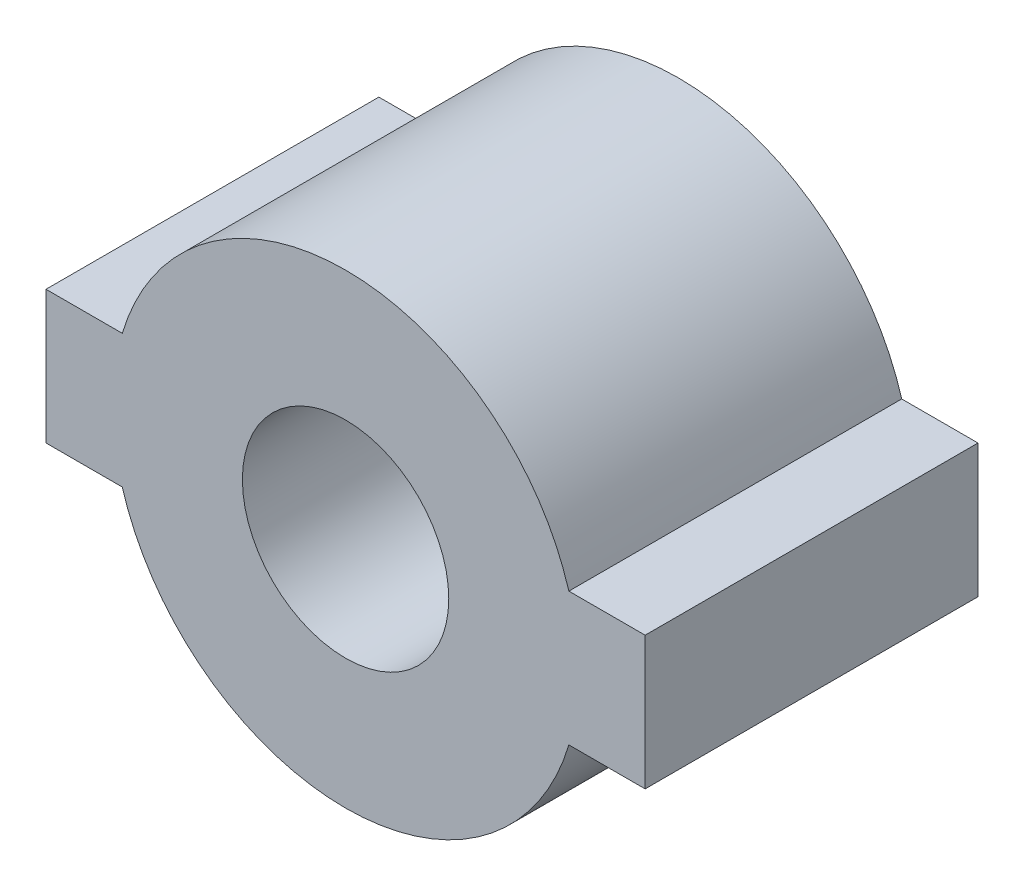
ISO-10303-21;
HEADER;
FILE_DESCRIPTION(('STEP AP214'),'2;1');
FILE_NAME('part.step','',(''),(''),'','','');
FILE_SCHEMA(('AUTOMOTIVE_DESIGN { 1 0 10303 214 1 1 1 1 }'));
ENDSEC;
DATA;
#1=APPLICATION_CONTEXT('core data for automotive mechanical design processes');
#2=APPLICATION_PROTOCOL_DEFINITION('international standard','automotive_design',2000,#1);
#3=PRODUCT_CONTEXT('',#1,'mechanical');
#4=PRODUCT('Part','Part','',(#3));
#5=PRODUCT_RELATED_PRODUCT_CATEGORY('part','',(#4));
#6=PRODUCT_DEFINITION_FORMATION('','',#4);
#7=PRODUCT_DEFINITION_CONTEXT('part definition',#1,'design');
#8=PRODUCT_DEFINITION('design','',#6,#7);
#9=PRODUCT_DEFINITION_SHAPE('','',#8);
#10=(LENGTH_UNIT() NAMED_UNIT(*) SI_UNIT(.MILLI.,.METRE.));
#11=(NAMED_UNIT(*) PLANE_ANGLE_UNIT() SI_UNIT($,.RADIAN.));
#12=(NAMED_UNIT(*) SI_UNIT($,.STERADIAN.) SOLID_ANGLE_UNIT());
#13=UNCERTAINTY_MEASURE_WITH_UNIT(LENGTH_MEASURE(1.E-05),#10,'distance_accuracy_value','');
#14=(GEOMETRIC_REPRESENTATION_CONTEXT(3) GLOBAL_UNCERTAINTY_ASSIGNED_CONTEXT((#13)) GLOBAL_UNIT_ASSIGNED_CONTEXT((#10,
#11,#12)) REPRESENTATION_CONTEXT('',''));
#15=CARTESIAN_POINT('',(0.,0.,0.));
#16=DIRECTION('',(0.,0.,1.));
#17=DIRECTION('',(1.,0.,0.));
#18=AXIS2_PLACEMENT_3D('',#15,#16,#17);
#19=CARTESIAN_POINT('',(0.,-1.,5.));
#20=DIRECTION('',(0.,1.,0.));
#21=DIRECTION('',(0.,0.,1.));
#22=AXIS2_PLACEMENT_3D('',#19,#20,#21);
#23=PLANE('',#22);
#24=DIRECTION('',(1.,0.,0.));
#25=VECTOR('',#24,1.);
#26=CARTESIAN_POINT('',(0.,-1.,0.));
#27=LINE('',#26,#25);
#28=CARTESIAN_POINT('',(-4.5,-1.,0.));
#29=VERTEX_POINT('',#28);
#30=CARTESIAN_POINT('',(-3.35410196624968,-1.,0.));
#31=VERTEX_POINT('',#30);
#32=EDGE_CURVE('E134',#29,#31,#27,.T.);
#33=ORIENTED_EDGE('',*,*,#32,.T.);
#34=DIRECTION('',(0.,0.,-1.));
#35=VECTOR('',#34,1.);
#36=CARTESIAN_POINT('',(-3.35410196624968,-1.,5.));
#37=LINE('',#36,#35);
#38=CARTESIAN_POINT('',(-3.35410196624968,-1.,5.));
#39=VERTEX_POINT('',#38);
#40=EDGE_CURVE('E11',#39,#31,#37,.T.);
#41=ORIENTED_EDGE('',*,*,#40,.F.);
#42=DIRECTION('',(1.,0.,0.));
#43=VECTOR('',#42,1.);
#44=CARTESIAN_POINT('',(0.,-1.,5.));
#45=LINE('',#44,#43);
#46=CARTESIAN_POINT('',(-4.5,-1.,5.));
#47=VERTEX_POINT('',#46);
#48=EDGE_CURVE('E179',#47,#39,#45,.T.);
#49=ORIENTED_EDGE('',*,*,#48,.F.);
#50=DIRECTION('',(0.,0.,-1.));
#51=VECTOR('',#50,1.);
#52=CARTESIAN_POINT('',(-4.5,-1.,5.));
#53=LINE('',#52,#51);
#54=EDGE_CURVE('E127',#47,#29,#53,.T.);
#55=ORIENTED_EDGE('',*,*,#54,.T.);
#56=EDGE_LOOP('',(#33,#41,#49,#55));
#57=FACE_BOUND('',#56,.T.);
#58=ADVANCED_FACE('F35',(#57),#23,.F.);
#59=CARTESIAN_POINT('',(0.,0.,5.));
#60=DIRECTION('',(0.,0.,-1.));
#61=DIRECTION('',(-1.,0.,0.));
#62=AXIS2_PLACEMENT_3D('',#59,#60,#61);
#63=CYLINDRICAL_SURFACE('',#62,3.5);
#64=CARTESIAN_POINT('',(0.,0.,0.));
#65=DIRECTION('',(0.,0.,1.));
#66=DIRECTION('',(1.,0.,0.));
#67=AXIS2_PLACEMENT_3D('',#64,#65,#66);
#68=CIRCLE('',#67,3.5);
#69=CARTESIAN_POINT('',(3.35410196624968,-1.,0.));
#70=VERTEX_POINT('',#69);
#71=EDGE_CURVE('E137',#31,#70,#68,.T.);
#72=ORIENTED_EDGE('',*,*,#71,.T.);
#73=DIRECTION('',(0.,0.,-1.));
#74=VECTOR('',#73,1.);
#75=CARTESIAN_POINT('',(3.35410196624968,-1.,5.));
#76=LINE('',#75,#74);
#77=CARTESIAN_POINT('',(3.35410196624968,-1.,5.));
#78=VERTEX_POINT('',#77);
#79=EDGE_CURVE('E44',#78,#70,#76,.T.);
#80=ORIENTED_EDGE('',*,*,#79,.F.);
#81=CARTESIAN_POINT('',(0.,0.,5.));
#82=DIRECTION('',(0.,0.,1.));
#83=DIRECTION('',(1.,0.,0.));
#84=AXIS2_PLACEMENT_3D('',#81,#82,#83);
#85=CIRCLE('',#84,3.5);
#86=EDGE_CURVE('E91',#39,#78,#85,.T.);
#87=ORIENTED_EDGE('',*,*,#86,.F.);
#88=ORIENTED_EDGE('',*,*,#40,.T.);
#89=EDGE_LOOP('',(#72,#80,#87,#88));
#90=FACE_BOUND('',#89,.T.);
#91=ADVANCED_FACE('F197',(#90),#63,.T.);
#92=CARTESIAN_POINT('',(0.,-1.,5.));
#93=DIRECTION('',(0.,1.,0.));
#94=DIRECTION('',(0.,0.,1.));
#95=AXIS2_PLACEMENT_3D('',#92,#93,#94);
#96=PLANE('',#95);
#97=DIRECTION('',(1.,0.,0.));
#98=VECTOR('',#97,1.);
#99=CARTESIAN_POINT('',(0.,-1.,0.));
#100=LINE('',#99,#98);
#101=CARTESIAN_POINT('',(4.5,-1.,0.));
#102=VERTEX_POINT('',#101);
#103=EDGE_CURVE('E139',#70,#102,#100,.T.);
#104=ORIENTED_EDGE('',*,*,#103,.T.);
#105=DIRECTION('',(0.,0.,-1.));
#106=VECTOR('',#105,1.);
#107=CARTESIAN_POINT('',(4.5,-1.,5.));
#108=LINE('',#107,#106);
#109=CARTESIAN_POINT('',(4.5,-1.,5.));
#110=VERTEX_POINT('',#109);
#111=EDGE_CURVE('E158',#110,#102,#108,.T.);
#112=ORIENTED_EDGE('',*,*,#111,.F.);
#113=DIRECTION('',(1.,0.,0.));
#114=VECTOR('',#113,1.);
#115=CARTESIAN_POINT('',(0.,-1.,5.));
#116=LINE('',#115,#114);
#117=EDGE_CURVE('E165',#78,#110,#116,.T.);
#118=ORIENTED_EDGE('',*,*,#117,.F.);
#119=ORIENTED_EDGE('',*,*,#79,.T.);
#120=EDGE_LOOP('',(#104,#112,#118,#119));
#121=FACE_BOUND('',#120,.T.);
#122=ADVANCED_FACE('F163',(#121),#96,.F.);
#123=CARTESIAN_POINT('',(4.5,0.,5.));
#124=DIRECTION('',(1.,0.,0.));
#125=DIRECTION('',(0.,0.,-1.));
#126=AXIS2_PLACEMENT_3D('',#123,#124,#125);
#127=PLANE('',#126);
#128=DIRECTION('',(0.,-1.,0.));
#129=VECTOR('',#128,1.);
#130=CARTESIAN_POINT('',(4.5,0.,0.));
#131=LINE('',#130,#129);
#132=CARTESIAN_POINT('',(4.5,1.,0.));
#133=VERTEX_POINT('',#132);
#134=EDGE_CURVE('E142',#133,#102,#131,.T.);
#135=ORIENTED_EDGE('',*,*,#134,.F.);
#136=DIRECTION('',(0.,0.,-1.));
#137=VECTOR('',#136,1.);
#138=CARTESIAN_POINT('',(4.5,1.,5.));
#139=LINE('',#138,#137);
#140=CARTESIAN_POINT('',(4.5,1.,5.));
#141=VERTEX_POINT('',#140);
#142=EDGE_CURVE('E156',#141,#133,#139,.T.);
#143=ORIENTED_EDGE('',*,*,#142,.F.);
#144=DIRECTION('',(0.,-1.,0.));
#145=VECTOR('',#144,1.);
#146=CARTESIAN_POINT('',(4.5,0.,5.));
#147=LINE('',#146,#145);
#148=EDGE_CURVE('E174',#141,#110,#147,.T.);
#149=ORIENTED_EDGE('',*,*,#148,.T.);
#150=ORIENTED_EDGE('',*,*,#111,.T.);
#151=EDGE_LOOP('',(#135,#143,#149,#150));
#152=FACE_BOUND('',#151,.T.);
#153=ADVANCED_FACE('F172',(#152),#127,.T.);
#154=CARTESIAN_POINT('',(0.,1.,5.));
#155=DIRECTION('',(0.,1.,0.));
#156=DIRECTION('',(0.,0.,1.));
#157=AXIS2_PLACEMENT_3D('',#154,#155,#156);
#158=PLANE('',#157);
#159=DIRECTION('',(1.,0.,0.));
#160=VECTOR('',#159,1.);
#161=CARTESIAN_POINT('',(0.,1.,0.));
#162=LINE('',#161,#160);
#163=CARTESIAN_POINT('',(3.35410196624968,1.,0.));
#164=VERTEX_POINT('',#163);
#165=EDGE_CURVE('E145',#164,#133,#162,.T.);
#166=ORIENTED_EDGE('',*,*,#165,.F.);
#167=DIRECTION('',(0.,0.,-1.));
#168=VECTOR('',#167,1.);
#169=CARTESIAN_POINT('',(3.35410196624968,1.,5.));
#170=LINE('',#169,#168);
#171=CARTESIAN_POINT('',(3.35410196624968,1.,5.));
#172=VERTEX_POINT('',#171);
#173=EDGE_CURVE('E123',#172,#164,#170,.T.);
#174=ORIENTED_EDGE('',*,*,#173,.F.);
#175=DIRECTION('',(1.,0.,0.));
#176=VECTOR('',#175,1.);
#177=CARTESIAN_POINT('',(0.,1.,5.));
#178=LINE('',#177,#176);
#179=EDGE_CURVE('E112',#172,#141,#178,.T.);
#180=ORIENTED_EDGE('',*,*,#179,.T.);
#181=ORIENTED_EDGE('',*,*,#142,.T.);
#182=EDGE_LOOP('',(#166,#174,#180,#181));
#183=FACE_BOUND('',#182,.T.);
#184=ADVANCED_FACE('F208',(#183),#158,.T.);
#185=CARTESIAN_POINT('',(0.,0.,5.));
#186=DIRECTION('',(0.,0.,-1.));
#187=DIRECTION('',(-1.,0.,0.));
#188=AXIS2_PLACEMENT_3D('',#185,#186,#187);
#189=CYLINDRICAL_SURFACE('',#188,3.5);
#190=CARTESIAN_POINT('',(0.,0.,0.));
#191=DIRECTION('',(0.,0.,1.));
#192=DIRECTION('',(1.,0.,0.));
#193=AXIS2_PLACEMENT_3D('',#190,#191,#192);
#194=CIRCLE('',#193,3.5);
#195=CARTESIAN_POINT('',(-3.35410196624968,1.,0.));
#196=VERTEX_POINT('',#195);
#197=EDGE_CURVE('E119',#164,#196,#194,.T.);
#198=ORIENTED_EDGE('',*,*,#197,.T.);
#199=DIRECTION('',(0.,0.,-1.));
#200=VECTOR('',#199,1.);
#201=CARTESIAN_POINT('',(-3.35410196624968,1.,5.));
#202=LINE('',#201,#200);
#203=CARTESIAN_POINT('',(-3.35410196624968,1.,5.));
#204=VERTEX_POINT('',#203);
#205=EDGE_CURVE('E116',#204,#196,#202,.T.);
#206=ORIENTED_EDGE('',*,*,#205,.F.);
#207=CARTESIAN_POINT('',(0.,0.,5.));
#208=DIRECTION('',(0.,0.,1.));
#209=DIRECTION('',(1.,0.,0.));
#210=AXIS2_PLACEMENT_3D('',#207,#208,#209);
#211=CIRCLE('',#210,3.5);
#212=EDGE_CURVE('E105',#172,#204,#211,.T.);
#213=ORIENTED_EDGE('',*,*,#212,.F.);
#214=ORIENTED_EDGE('',*,*,#173,.T.);
#215=EDGE_LOOP('',(#198,#206,#213,#214));
#216=FACE_BOUND('',#215,.T.);
#217=ADVANCED_FACE('F117',(#216),#189,.T.);
#218=CARTESIAN_POINT('',(0.,1.,5.));
#219=DIRECTION('',(0.,1.,0.));
#220=DIRECTION('',(0.,0.,1.));
#221=AXIS2_PLACEMENT_3D('',#218,#219,#220);
#222=PLANE('',#221);
#223=DIRECTION('',(1.,0.,0.));
#224=VECTOR('',#223,1.);
#225=CARTESIAN_POINT('',(0.,1.,0.));
#226=LINE('',#225,#224);
#227=CARTESIAN_POINT('',(-4.5,1.,0.));
#228=VERTEX_POINT('',#227);
#229=EDGE_CURVE('E149',#228,#196,#226,.T.);
#230=ORIENTED_EDGE('',*,*,#229,.F.);
#231=DIRECTION('',(0.,0.,-1.));
#232=VECTOR('',#231,1.);
#233=CARTESIAN_POINT('',(-4.5,1.,5.));
#234=LINE('',#233,#232);
#235=CARTESIAN_POINT('',(-4.5,1.,5.));
#236=VERTEX_POINT('',#235);
#237=EDGE_CURVE('E80',#236,#228,#234,.T.);
#238=ORIENTED_EDGE('',*,*,#237,.F.);
#239=DIRECTION('',(1.,0.,0.));
#240=VECTOR('',#239,1.);
#241=CARTESIAN_POINT('',(0.,1.,5.));
#242=LINE('',#241,#240);
#243=EDGE_CURVE('E109',#236,#204,#242,.T.);
#244=ORIENTED_EDGE('',*,*,#243,.T.);
#245=ORIENTED_EDGE('',*,*,#205,.T.);
#246=EDGE_LOOP('',(#230,#238,#244,#245));
#247=FACE_BOUND('',#246,.T.);
#248=ADVANCED_FACE('F125',(#247),#222,.T.);
#249=CARTESIAN_POINT('',(0.,0.,5.));
#250=DIRECTION('',(0.,0.,-1.));
#251=DIRECTION('',(-1.,0.,0.));
#252=AXIS2_PLACEMENT_3D('',#249,#250,#251);
#253=CYLINDRICAL_SURFACE('',#252,1.55);
#254=CARTESIAN_POINT('',(0.,0.,5.));
#255=DIRECTION('',(0.,0.,1.));
#256=DIRECTION('',(1.,0.,0.));
#257=AXIS2_PLACEMENT_3D('',#254,#255,#256);
#258=CIRCLE('',#257,1.55);
#259=CARTESIAN_POINT('',(1.55,0.,5.));
#260=VERTEX_POINT('',#259);
#261=EDGE_CURVE('E152',#260,#260,#258,.T.);
#262=ORIENTED_EDGE('',*,*,#261,.T.);
#263=EDGE_LOOP('',(#262));
#264=FACE_BOUND('',#263,.T.);
#265=CARTESIAN_POINT('',(0.,0.,0.));
#266=DIRECTION('',(0.,0.,1.));
#267=DIRECTION('',(1.,0.,0.));
#268=AXIS2_PLACEMENT_3D('',#265,#266,#267);
#269=CIRCLE('',#268,1.55);
#270=CARTESIAN_POINT('',(1.55,0.,0.));
#271=VERTEX_POINT('',#270);
#272=EDGE_CURVE('E131',#271,#271,#269,.T.);
#273=ORIENTED_EDGE('',*,*,#272,.F.);
#274=EDGE_LOOP('',(#273));
#275=FACE_BOUND('',#274,.T.);
#276=ADVANCED_FACE('F37',(#264,#275),#253,.F.);
#277=CARTESIAN_POINT('',(-4.5,0.,5.));
#278=DIRECTION('',(1.,0.,0.));
#279=DIRECTION('',(0.,0.,-1.));
#280=AXIS2_PLACEMENT_3D('',#277,#278,#279);
#281=PLANE('',#280);
#282=DIRECTION('',(0.,-1.,0.));
#283=VECTOR('',#282,1.);
#284=CARTESIAN_POINT('',(-4.5,0.,0.));
#285=LINE('',#284,#283);
#286=EDGE_CURVE('E83',#228,#29,#285,.T.);
#287=ORIENTED_EDGE('',*,*,#286,.T.);
#288=ORIENTED_EDGE('',*,*,#54,.F.);
#289=DIRECTION('',(0.,-1.,0.));
#290=VECTOR('',#289,1.);
#291=CARTESIAN_POINT('',(-4.5,0.,5.));
#292=LINE('',#291,#290);
#293=EDGE_CURVE('E52',#236,#47,#292,.T.);
#294=ORIENTED_EDGE('',*,*,#293,.F.);
#295=ORIENTED_EDGE('',*,*,#237,.T.);
#296=EDGE_LOOP('',(#287,#288,#294,#295));
#297=FACE_BOUND('',#296,.T.);
#298=ADVANCED_FACE('F187',(#297),#281,.F.);
#299=CARTESIAN_POINT('',(0.,0.,5.));
#300=DIRECTION('',(0.,0.,1.));
#301=DIRECTION('',(1.,0.,0.));
#302=AXIS2_PLACEMENT_3D('',#299,#300,#301);
#303=PLANE('',#302);
#304=ORIENTED_EDGE('',*,*,#261,.F.);
#305=EDGE_LOOP('',(#304));
#306=FACE_BOUND('',#305,.T.);
#307=ORIENTED_EDGE('',*,*,#48,.T.);
#308=ORIENTED_EDGE('',*,*,#86,.T.);
#309=ORIENTED_EDGE('',*,*,#117,.T.);
#310=ORIENTED_EDGE('',*,*,#148,.F.);
#311=ORIENTED_EDGE('',*,*,#179,.F.);
#312=ORIENTED_EDGE('',*,*,#212,.T.);
#313=ORIENTED_EDGE('',*,*,#243,.F.);
#314=ORIENTED_EDGE('',*,*,#293,.T.);
#315=EDGE_LOOP('',(#307,#308,#309,#310,#311,#312,#313,#314));
#316=FACE_BOUND('',#315,.T.);
#317=ADVANCED_FACE('F107',(#306,#316),#303,.T.);
#318=CARTESIAN_POINT('',(0.,0.,0.));
#319=DIRECTION('',(0.,0.,1.));
#320=DIRECTION('',(1.,0.,0.));
#321=AXIS2_PLACEMENT_3D('',#318,#319,#320);
#322=PLANE('',#321);
#323=ORIENTED_EDGE('',*,*,#272,.T.);
#324=EDGE_LOOP('',(#323));
#325=FACE_BOUND('',#324,.T.);
#326=ORIENTED_EDGE('',*,*,#32,.F.);
#327=ORIENTED_EDGE('',*,*,#286,.F.);
#328=ORIENTED_EDGE('',*,*,#229,.T.);
#329=ORIENTED_EDGE('',*,*,#197,.F.);
#330=ORIENTED_EDGE('',*,*,#165,.T.);
#331=ORIENTED_EDGE('',*,*,#134,.T.);
#332=ORIENTED_EDGE('',*,*,#103,.F.);
#333=ORIENTED_EDGE('',*,*,#71,.F.);
#334=EDGE_LOOP('',(#326,#327,#328,#329,#330,#331,#332,#333));
#335=FACE_BOUND('',#334,.T.);
#336=ADVANCED_FACE('F168',(#325,#335),#322,.F.);
#337=CLOSED_SHELL('',(#58,#91,#122,#153,#184,#217,#248,#276,#298,#317,#336));
#338=MANIFOLD_SOLID_BREP('B2',#337);
#339=ADVANCED_BREP_SHAPE_REPRESENTATION('',(#18,#338),#14);
#340=SHAPE_DEFINITION_REPRESENTATION(#9,#339);
ENDSEC;
END-ISO-10303-21;
